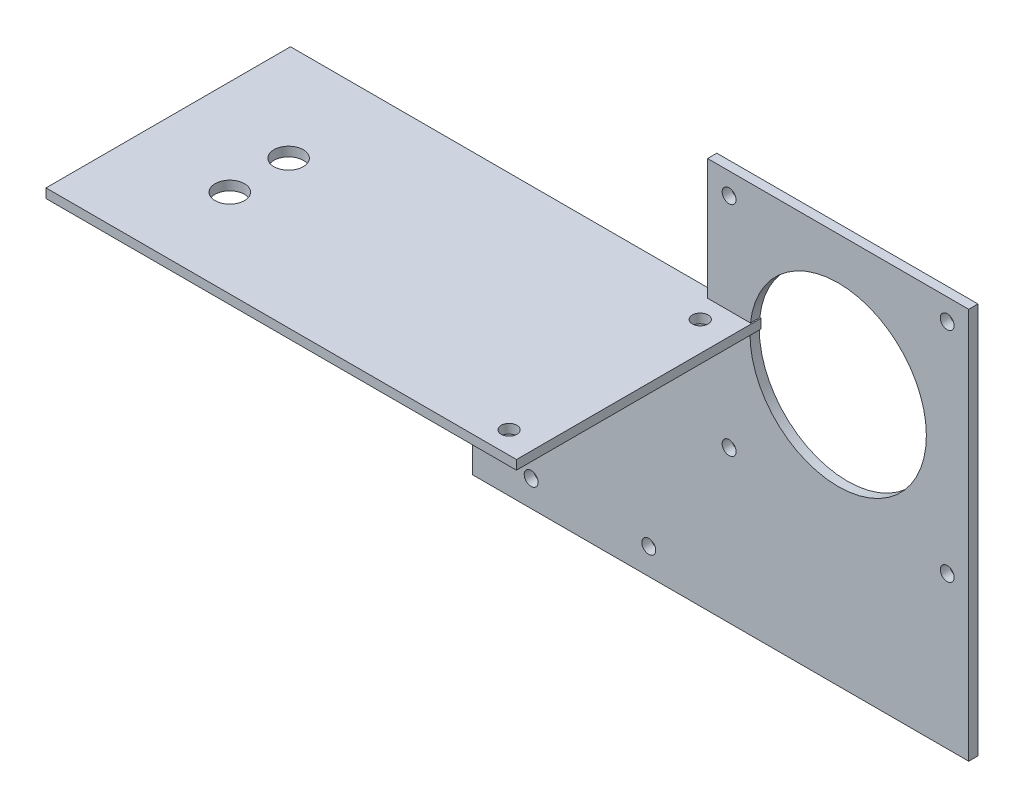
ISO-10303-21;
HEADER;
FILE_DESCRIPTION(('STEP AP214'),'2;1');
FILE_NAME('part.step','',(''),(''),'','','');
FILE_SCHEMA(('AUTOMOTIVE_DESIGN { 1 0 10303 214 1 1 1 1 }'));
ENDSEC;
DATA;
#1=APPLICATION_CONTEXT('core data for automotive mechanical design processes');
#2=APPLICATION_PROTOCOL_DEFINITION('international standard','automotive_design',2000,#1);
#3=PRODUCT_CONTEXT('',#1,'mechanical');
#4=PRODUCT('Part','Part','',(#3));
#5=PRODUCT_RELATED_PRODUCT_CATEGORY('part','',(#4));
#6=PRODUCT_DEFINITION_FORMATION('','',#4);
#7=PRODUCT_DEFINITION_CONTEXT('part definition',#1,'design');
#8=PRODUCT_DEFINITION('design','',#6,#7);
#9=PRODUCT_DEFINITION_SHAPE('','',#8);
#10=(LENGTH_UNIT() NAMED_UNIT(*) SI_UNIT(.MILLI.,.METRE.));
#11=(NAMED_UNIT(*) PLANE_ANGLE_UNIT() SI_UNIT($,.RADIAN.));
#12=(NAMED_UNIT(*) SI_UNIT($,.STERADIAN.) SOLID_ANGLE_UNIT());
#13=UNCERTAINTY_MEASURE_WITH_UNIT(LENGTH_MEASURE(1.E-05),#10,'distance_accuracy_value','');
#14=(GEOMETRIC_REPRESENTATION_CONTEXT(3) GLOBAL_UNCERTAINTY_ASSIGNED_CONTEXT((#13)) GLOBAL_UNIT_ASSIGNED_CONTEXT((#10,
#11,#12)) REPRESENTATION_CONTEXT('',''));
#15=CARTESIAN_POINT('',(0.,0.,0.));
#16=DIRECTION('',(0.,0.,1.));
#17=DIRECTION('',(1.,0.,0.));
#18=AXIS2_PLACEMENT_3D('',#15,#16,#17);
#19=CARTESIAN_POINT('',(0.,58.4,-2.));
#20=DIRECTION('',(0.,1.,0.));
#21=DIRECTION('',(-1.,0.,0.));
#22=AXIS2_PLACEMENT_3D('',#19,#20,#21);
#23=PLANE('',#22);
#24=CARTESIAN_POINT('',(-20.6375,58.4,31.75));
#25=DIRECTION('',(0.,1.,0.));
#26=DIRECTION('',(-1.,0.,0.));
#27=AXIS2_PLACEMENT_3D('',#24,#25,#26);
#28=CIRCLE('',#27,3.175);
#29=CARTESIAN_POINT('',(-23.8125,58.4,31.75));
#30=VERTEX_POINT('',#29);
#31=EDGE_CURVE('E166',#30,#30,#28,.T.);
#32=ORIENTED_EDGE('',*,*,#31,.F.);
#33=EDGE_LOOP('',(#32));
#34=FACE_BOUND('',#33,.T.);
#35=CARTESIAN_POINT('',(-20.6375,58.4,19.05));
#36=DIRECTION('',(0.,1.,0.));
#37=DIRECTION('',(-1.,0.,0.));
#38=AXIS2_PLACEMENT_3D('',#35,#36,#37);
#39=CIRCLE('',#38,3.175);
#40=CARTESIAN_POINT('',(-23.8125,58.4,19.05));
#41=VERTEX_POINT('',#40);
#42=EDGE_CURVE('E156',#41,#41,#39,.T.);
#43=ORIENTED_EDGE('',*,*,#42,.F.);
#44=EDGE_LOOP('',(#43));
#45=FACE_BOUND('',#44,.T.);
#46=CARTESIAN_POINT('',(53.975,58.4,46.0375));
#47=DIRECTION('',(0.,1.,0.));
#48=DIRECTION('',(-1.,0.,0.));
#49=AXIS2_PLACEMENT_3D('',#46,#47,#48);
#50=CIRCLE('',#49,1.7);
#51=CARTESIAN_POINT('',(52.275,58.4,46.0375));
#52=VERTEX_POINT('',#51);
#53=EDGE_CURVE('E153',#52,#52,#50,.T.);
#54=ORIENTED_EDGE('',*,*,#53,.F.);
#55=EDGE_LOOP('',(#54));
#56=FACE_BOUND('',#55,.T.);
#57=CARTESIAN_POINT('',(53.975,58.4,4.7625));
#58=DIRECTION('',(0.,1.,0.));
#59=DIRECTION('',(-1.,0.,0.));
#60=AXIS2_PLACEMENT_3D('',#57,#58,#59);
#61=CIRCLE('',#60,1.7);
#62=CARTESIAN_POINT('',(52.275,58.4,4.7625));
#63=VERTEX_POINT('',#62);
#64=EDGE_CURVE('E150',#63,#63,#61,.T.);
#65=ORIENTED_EDGE('',*,*,#64,.F.);
#66=EDGE_LOOP('',(#65));
#67=FACE_BOUND('',#66,.T.);
#68=DIRECTION('',(-1.,0.,0.));
#69=VECTOR('',#68,1.);
#70=CARTESIAN_POINT('',(0.,58.4,-2.));
#71=LINE('',#70,#69);
#72=CARTESIAN_POINT('',(50.8,58.4,-2.));
#73=VERTEX_POINT('',#72);
#74=CARTESIAN_POINT('',(-41.275,58.4,-2.));
#75=VERTEX_POINT('',#74);
#76=EDGE_CURVE('E139',#73,#75,#71,.T.);
#77=ORIENTED_EDGE('',*,*,#76,.T.);
#78=DIRECTION('',(0.,0.,-1.));
#79=VECTOR('',#78,1.);
#80=CARTESIAN_POINT('',(-41.275,58.4,50.8));
#81=LINE('',#80,#79);
#82=CARTESIAN_POINT('',(-41.275,58.4,50.8));
#83=VERTEX_POINT('',#82);
#84=EDGE_CURVE('E193',#83,#75,#81,.T.);
#85=ORIENTED_EDGE('',*,*,#84,.F.);
#86=DIRECTION('',(1.,0.,0.));
#87=VECTOR('',#86,1.);
#88=CARTESIAN_POINT('',(60.325,58.4,50.8));
#89=LINE('',#88,#87);
#90=CARTESIAN_POINT('',(60.325,58.4,50.8));
#91=VERTEX_POINT('',#90);
#92=EDGE_CURVE('E171',#83,#91,#89,.T.);
#93=ORIENTED_EDGE('',*,*,#92,.T.);
#94=DIRECTION('',(0.,0.,-1.));
#95=VECTOR('',#94,1.);
#96=CARTESIAN_POINT('',(60.325,58.4,50.8));
#97=LINE('',#96,#95);
#98=CARTESIAN_POINT('',(60.325,58.4,-2.));
#99=VERTEX_POINT('',#98);
#100=EDGE_CURVE('E184',#91,#99,#97,.T.);
#101=ORIENTED_EDGE('',*,*,#100,.T.);
#102=DIRECTION('',(1.,0.,0.));
#103=VECTOR('',#102,1.);
#104=CARTESIAN_POINT('',(0.,58.4,-2.));
#105=LINE('',#104,#103);
#106=CARTESIAN_POINT('',(60.0625754399979,58.4,-2.));
#107=VERTEX_POINT('',#106);
#108=EDGE_CURVE('E175',#107,#99,#105,.T.);
#109=ORIENTED_EDGE('',*,*,#108,.F.);
#110=DIRECTION('',(0.,0.,1.));
#111=VECTOR('',#110,1.);
#112=CARTESIAN_POINT('',(60.0625754399979,58.4,-2.));
#113=LINE('',#112,#111);
#114=CARTESIAN_POINT('',(60.0625754399979,58.4,0.));
#115=VERTEX_POINT('',#114);
#116=EDGE_CURVE('E11',#115,#107,#113,.F.);
#117=ORIENTED_EDGE('',*,*,#116,.F.);
#118=DIRECTION('',(-1.,0.,0.));
#119=VECTOR('',#118,1.);
#120=CARTESIAN_POINT('',(0.,58.4,0.));
#121=LINE('',#120,#119);
#122=CARTESIAN_POINT('',(50.8,58.4,0.));
#123=VERTEX_POINT('',#122);
#124=EDGE_CURVE('E210',#115,#123,#121,.T.);
#125=ORIENTED_EDGE('',*,*,#124,.T.);
#126=DIRECTION('',(0.,0.,1.));
#127=VECTOR('',#126,1.);
#128=CARTESIAN_POINT('',(50.8,58.4,-2.));
#129=LINE('',#128,#127);
#130=EDGE_CURVE('E59',#73,#123,#129,.T.);
#131=ORIENTED_EDGE('',*,*,#130,.F.);
#132=EDGE_LOOP('',(#77,#85,#93,#101,#109,#117,#125,#131));
#133=FACE_BOUND('',#132,.T.);
#134=ADVANCED_FACE('F34',(#34,#45,#56,#67,#133),#23,.T.);
#135=CARTESIAN_POINT('',(50.8,58.4,-2.));
#136=DIRECTION('',(-1.,0.,0.));
#137=DIRECTION('',(0.,0.,1.));
#138=AXIS2_PLACEMENT_3D('',#135,#136,#137);
#139=PLANE('',#138);
#140=DIRECTION('',(0.,-1.,0.));
#141=VECTOR('',#140,1.);
#142=CARTESIAN_POINT('',(50.8,58.4,0.));
#143=LINE('',#142,#141);
#144=CARTESIAN_POINT('',(50.8,84.53204182,0.));
#145=VERTEX_POINT('',#144);
#146=EDGE_CURVE('E136',#145,#123,#143,.T.);
#147=ORIENTED_EDGE('',*,*,#146,.F.);
#148=DIRECTION('',(0.,0.,1.));
#149=VECTOR('',#148,1.);
#150=CARTESIAN_POINT('',(50.8,84.53204182,-2.));
#151=LINE('',#150,#149);
#152=CARTESIAN_POINT('',(50.8,84.53204182,-2.));
#153=VERTEX_POINT('',#152);
#154=EDGE_CURVE('E81',#153,#145,#151,.T.);
#155=ORIENTED_EDGE('',*,*,#154,.F.);
#156=DIRECTION('',(0.,-1.,0.));
#157=VECTOR('',#156,1.);
#158=CARTESIAN_POINT('',(50.8,58.4,-2.));
#159=LINE('',#158,#157);
#160=EDGE_CURVE('E117',#153,#73,#159,.T.);
#161=ORIENTED_EDGE('',*,*,#160,.T.);
#162=ORIENTED_EDGE('',*,*,#130,.T.);
#163=EDGE_LOOP('',(#147,#155,#161,#162));
#164=FACE_BOUND('',#163,.T.);
#165=ADVANCED_FACE('F315',(#164),#139,.T.);
#166=CARTESIAN_POINT('',(50.8,84.53204182,-2.));
#167=DIRECTION('',(0.,1.,0.));
#168=DIRECTION('',(0.,0.,1.));
#169=AXIS2_PLACEMENT_3D('',#166,#167,#168);
#170=PLANE('',#169);
#171=DIRECTION('',(-1.,0.,0.));
#172=VECTOR('',#171,1.);
#173=CARTESIAN_POINT('',(50.8,84.53204182,0.));
#174=LINE('',#173,#172);
#175=CARTESIAN_POINT('',(107.2,84.53204182,0.));
#176=VERTEX_POINT('',#175);
#177=EDGE_CURVE('E102',#176,#145,#174,.T.);
#178=ORIENTED_EDGE('',*,*,#177,.F.);
#179=DIRECTION('',(0.,0.,1.));
#180=VECTOR('',#179,1.);
#181=CARTESIAN_POINT('',(107.2,84.53204182,-2.));
#182=LINE('',#181,#180);
#183=CARTESIAN_POINT('',(107.2,84.53204182,-2.));
#184=VERTEX_POINT('',#183);
#185=EDGE_CURVE('E97',#184,#176,#182,.T.);
#186=ORIENTED_EDGE('',*,*,#185,.F.);
#187=DIRECTION('',(-1.,0.,0.));
#188=VECTOR('',#187,1.);
#189=CARTESIAN_POINT('',(50.8,84.53204182,-2.));
#190=LINE('',#189,#188);
#191=EDGE_CURVE('E100',#184,#153,#190,.T.);
#192=ORIENTED_EDGE('',*,*,#191,.T.);
#193=ORIENTED_EDGE('',*,*,#154,.T.);
#194=EDGE_LOOP('',(#178,#186,#192,#193));
#195=FACE_BOUND('',#194,.T.);
#196=ADVANCED_FACE('F99',(#195),#170,.T.);
#197=CARTESIAN_POINT('',(107.2,84.53204182,-2.));
#198=DIRECTION('',(1.,0.,0.));
#199=DIRECTION('',(0.,0.,-1.));
#200=AXIS2_PLACEMENT_3D('',#197,#198,#199);
#201=PLANE('',#200);
#202=DIRECTION('',(0.,1.,0.));
#203=VECTOR('',#202,1.);
#204=CARTESIAN_POINT('',(107.2,84.53204182,0.));
#205=LINE('',#204,#203);
#206=CARTESIAN_POINT('',(107.2,0.,0.));
#207=VERTEX_POINT('',#206);
#208=EDGE_CURVE('E133',#207,#176,#205,.T.);
#209=ORIENTED_EDGE('',*,*,#208,.F.);
#210=DIRECTION('',(0.,0.,1.));
#211=VECTOR('',#210,1.);
#212=CARTESIAN_POINT('',(107.2,0.,-2.));
#213=LINE('',#212,#211);
#214=CARTESIAN_POINT('',(107.2,0.,-2.));
#215=VERTEX_POINT('',#214);
#216=EDGE_CURVE('E107',#215,#207,#213,.T.);
#217=ORIENTED_EDGE('',*,*,#216,.F.);
#218=DIRECTION('',(0.,1.,0.));
#219=VECTOR('',#218,1.);
#220=CARTESIAN_POINT('',(107.2,84.53204182,-2.));
#221=LINE('',#220,#219);
#222=EDGE_CURVE('E114',#215,#184,#221,.T.);
#223=ORIENTED_EDGE('',*,*,#222,.T.);
#224=ORIENTED_EDGE('',*,*,#185,.T.);
#225=EDGE_LOOP('',(#209,#217,#223,#224));
#226=FACE_BOUND('',#225,.T.);
#227=ADVANCED_FACE('F119',(#226),#201,.T.);
#228=CARTESIAN_POINT('',(0.,0.,-2.));
#229=DIRECTION('',(0.,-1.,0.));
#230=DIRECTION('',(0.,0.,-1.));
#231=AXIS2_PLACEMENT_3D('',#228,#229,#230);
#232=PLANE('',#231);
#233=DIRECTION('',(1.,0.,0.));
#234=VECTOR('',#233,1.);
#235=CARTESIAN_POINT('',(0.,0.,0.));
#236=LINE('',#235,#234);
#237=CARTESIAN_POINT('',(0.,0.,0.));
#238=VERTEX_POINT('',#237);
#239=EDGE_CURVE('E129',#238,#207,#236,.T.);
#240=ORIENTED_EDGE('',*,*,#239,.F.);
#241=DIRECTION('',(0.,0.,1.));
#242=VECTOR('',#241,1.);
#243=CARTESIAN_POINT('',(0.,0.,-2.));
#244=LINE('',#243,#242);
#245=CARTESIAN_POINT('',(0.,0.,-2.));
#246=VERTEX_POINT('',#245);
#247=EDGE_CURVE('E126',#246,#238,#244,.T.);
#248=ORIENTED_EDGE('',*,*,#247,.F.);
#249=DIRECTION('',(1.,0.,0.));
#250=VECTOR('',#249,1.);
#251=CARTESIAN_POINT('',(0.,0.,-2.));
#252=LINE('',#251,#250);
#253=EDGE_CURVE('E120',#246,#215,#252,.T.);
#254=ORIENTED_EDGE('',*,*,#253,.T.);
#255=ORIENTED_EDGE('',*,*,#216,.T.);
#256=EDGE_LOOP('',(#240,#248,#254,#255));
#257=FACE_BOUND('',#256,.T.);
#258=ADVANCED_FACE('F322',(#257),#232,.T.);
#259=CARTESIAN_POINT('',(0.,58.4,-2.));
#260=DIRECTION('',(-1.,0.,0.));
#261=DIRECTION('',(0.,0.,1.));
#262=AXIS2_PLACEMENT_3D('',#259,#260,#261);
#263=PLANE('',#262);
#264=DIRECTION('',(0.,0.,1.));
#265=VECTOR('',#264,1.);
#266=CARTESIAN_POINT('',(0.,56.4,-2.));
#267=LINE('',#266,#265);
#268=CARTESIAN_POINT('',(0.,56.4,-2.));
#269=VERTEX_POINT('',#268);
#270=CARTESIAN_POINT('',(0.,56.4,0.));
#271=VERTEX_POINT('',#270);
#272=EDGE_CURVE('E207',#269,#271,#267,.T.);
#273=ORIENTED_EDGE('',*,*,#272,.F.);
#274=DIRECTION('',(0.,-1.,0.));
#275=VECTOR('',#274,1.);
#276=CARTESIAN_POINT('',(0.,58.4,-2.));
#277=LINE('',#276,#275);
#278=EDGE_CURVE('E90',#269,#246,#277,.T.);
#279=ORIENTED_EDGE('',*,*,#278,.T.);
#280=ORIENTED_EDGE('',*,*,#247,.T.);
#281=DIRECTION('',(0.,-1.,0.));
#282=VECTOR('',#281,1.);
#283=CARTESIAN_POINT('',(0.,58.4,0.));
#284=LINE('',#283,#282);
#285=EDGE_CURVE('E127',#271,#238,#284,.T.);
#286=ORIENTED_EDGE('',*,*,#285,.F.);
#287=EDGE_LOOP('',(#273,#279,#280,#286));
#288=FACE_BOUND('',#287,.T.);
#289=ADVANCED_FACE('F323',(#288),#263,.T.);
#290=CARTESIAN_POINT('',(0.,0.,-2.));
#291=DIRECTION('',(0.,0.,1.));
#292=DIRECTION('',(1.,0.,0.));
#293=AXIS2_PLACEMENT_3D('',#290,#291,#292);
#294=PLANE('',#293);
#295=ORIENTED_EDGE('',*,*,#76,.F.);
#296=ORIENTED_EDGE('',*,*,#160,.F.);
#297=ORIENTED_EDGE('',*,*,#191,.F.);
#298=ORIENTED_EDGE('',*,*,#222,.F.);
#299=ORIENTED_EDGE('',*,*,#253,.F.);
#300=ORIENTED_EDGE('',*,*,#278,.F.);
#301=DIRECTION('',(-1.,0.,0.));
#302=VECTOR('',#301,1.);
#303=CARTESIAN_POINT('',(-41.275,56.4,-2.));
#304=LINE('',#303,#302);
#305=CARTESIAN_POINT('',(-41.275,56.4,-2.));
#306=VERTEX_POINT('',#305);
#307=EDGE_CURVE('E186',#269,#306,#304,.T.);
#308=ORIENTED_EDGE('',*,*,#307,.T.);
#309=DIRECTION('',(0.,1.,0.));
#310=VECTOR('',#309,1.);
#311=CARTESIAN_POINT('',(-41.275,58.4,-2.));
#312=LINE('',#311,#310);
#313=EDGE_CURVE('E188',#306,#75,#312,.T.);
#314=ORIENTED_EDGE('',*,*,#313,.T.);
#315=EDGE_LOOP('',(#295,#296,#297,#298,#299,#300,#308,#314));
#316=FACE_BOUND('',#315,.T.);
#317=CARTESIAN_POINT('',(38.1,5.65,-2.));
#318=DIRECTION('',(0.,0.,1.));
#319=DIRECTION('',(1.,0.,0.));
#320=AXIS2_PLACEMENT_3D('',#317,#318,#319);
#321=CIRCLE('',#320,1.5);
#322=CARTESIAN_POINT('',(39.6,5.65,-2.));
#323=VERTEX_POINT('',#322);
#324=EDGE_CURVE('E218',#323,#323,#321,.T.);
#325=ORIENTED_EDGE('',*,*,#324,.T.);
#326=EDGE_LOOP('',(#325));
#327=FACE_BOUND('',#326,.T.);
#328=CARTESIAN_POINT('',(12.7,5.65000000000001,-2.));
#329=DIRECTION('',(0.,0.,1.));
#330=DIRECTION('',(1.,0.,0.));
#331=AXIS2_PLACEMENT_3D('',#328,#329,#330);
#332=CIRCLE('',#331,1.5);
#333=CARTESIAN_POINT('',(14.2,5.65000000000001,-2.));
#334=VERTEX_POINT('',#333);
#335=EDGE_CURVE('E224',#334,#334,#332,.T.);
#336=ORIENTED_EDGE('',*,*,#335,.T.);
#337=EDGE_LOOP('',(#336));
#338=FACE_BOUND('',#337,.T.);
#339=CARTESIAN_POINT('',(38.1,52.75,-2.));
#340=DIRECTION('',(0.,0.,1.));
#341=DIRECTION('',(1.,0.,0.));
#342=AXIS2_PLACEMENT_3D('',#339,#340,#341);
#343=CIRCLE('',#342,1.5);
#344=CARTESIAN_POINT('',(39.6,52.75,-2.));
#345=VERTEX_POINT('',#344);
#346=EDGE_CURVE('E230',#345,#345,#343,.T.);
#347=ORIENTED_EDGE('',*,*,#346,.T.);
#348=EDGE_LOOP('',(#347));
#349=FACE_BOUND('',#348,.T.);
#350=CARTESIAN_POINT('',(12.7,52.75,-2.));
#351=DIRECTION('',(0.,0.,1.));
#352=DIRECTION('',(1.,0.,0.));
#353=AXIS2_PLACEMENT_3D('',#350,#351,#352);
#354=CIRCLE('',#353,1.5);
#355=CARTESIAN_POINT('',(14.2,52.75,-2.));
#356=VERTEX_POINT('',#355);
#357=EDGE_CURVE('E236',#356,#356,#354,.T.);
#358=ORIENTED_EDGE('',*,*,#357,.T.);
#359=EDGE_LOOP('',(#358));
#360=FACE_BOUND('',#359,.T.);
#361=CARTESIAN_POINT('',(55.45,79.88204182,-2.));
#362=DIRECTION('',(0.,0.,1.));
#363=DIRECTION('',(1.,0.,0.));
#364=AXIS2_PLACEMENT_3D('',#361,#362,#363);
#365=CIRCLE('',#364,1.5);
#366=CARTESIAN_POINT('',(56.95,79.88204182,-2.));
#367=VERTEX_POINT('',#366);
#368=EDGE_CURVE('E242',#367,#367,#365,.T.);
#369=ORIENTED_EDGE('',*,*,#368,.T.);
#370=EDGE_LOOP('',(#369));
#371=FACE_BOUND('',#370,.T.);
#372=CARTESIAN_POINT('',(55.45,32.78204182,-2.));
#373=DIRECTION('',(0.,0.,1.));
#374=DIRECTION('',(1.,0.,0.));
#375=AXIS2_PLACEMENT_3D('',#372,#373,#374);
#376=CIRCLE('',#375,1.5);
#377=CARTESIAN_POINT('',(56.95,32.78204182,-2.));
#378=VERTEX_POINT('',#377);
#379=EDGE_CURVE('E248',#378,#378,#376,.T.);
#380=ORIENTED_EDGE('',*,*,#379,.T.);
#381=EDGE_LOOP('',(#380));
#382=FACE_BOUND('',#381,.T.);
#383=CARTESIAN_POINT('',(102.55,32.78204182,-2.));
#384=DIRECTION('',(0.,0.,1.));
#385=DIRECTION('',(1.,0.,0.));
#386=AXIS2_PLACEMENT_3D('',#383,#384,#385);
#387=CIRCLE('',#386,1.5);
#388=CARTESIAN_POINT('',(104.05,32.78204182,-2.));
#389=VERTEX_POINT('',#388);
#390=EDGE_CURVE('E254',#389,#389,#387,.T.);
#391=ORIENTED_EDGE('',*,*,#390,.T.);
#392=EDGE_LOOP('',(#391));
#393=FACE_BOUND('',#392,.T.);
#394=CARTESIAN_POINT('',(102.55,79.88204182,-2.));
#395=DIRECTION('',(0.,0.,1.));
#396=DIRECTION('',(1.,0.,0.));
#397=AXIS2_PLACEMENT_3D('',#394,#395,#396);
#398=CIRCLE('',#397,1.5);
#399=CARTESIAN_POINT('',(104.05,79.88204182,-2.));
#400=VERTEX_POINT('',#399);
#401=EDGE_CURVE('E130',#400,#400,#398,.T.);
#402=ORIENTED_EDGE('',*,*,#401,.T.);
#403=EDGE_LOOP('',(#402));
#404=FACE_BOUND('',#403,.T.);
#405=CARTESIAN_POINT('',(79.,56.33204182,-2.));
#406=DIRECTION('',(0.,0.,1.));
#407=DIRECTION('',(1.,0.,0.));
#408=AXIS2_PLACEMENT_3D('',#405,#406,#407);
#409=CIRCLE('',#408,19.05);
#410=CARTESIAN_POINT('',(59.9501212159822,56.4,-2.));
#411=VERTEX_POINT('',#410);
#412=EDGE_CURVE('E213',#411,#107,#409,.T.);
#413=ORIENTED_EDGE('',*,*,#412,.T.);
#414=ORIENTED_EDGE('',*,*,#108,.T.);
#415=DIRECTION('',(0.,-1.,0.));
#416=VECTOR('',#415,1.);
#417=CARTESIAN_POINT('',(60.325,56.4,-2.));
#418=LINE('',#417,#416);
#419=CARTESIAN_POINT('',(60.325,56.4,-2.));
#420=VERTEX_POINT('',#419);
#421=EDGE_CURVE('E149',#99,#420,#418,.T.);
#422=ORIENTED_EDGE('',*,*,#421,.T.);
#423=EDGE_CURVE('E50',#420,#411,#304,.T.);
#424=ORIENTED_EDGE('',*,*,#423,.T.);
#425=EDGE_LOOP('',(#413,#414,#422,#424));
#426=FACE_BOUND('',#425,.T.);
#427=ADVANCED_FACE('F111',(#316,#327,#338,#349,#360,#371,#382,#393,#404,#426),#294,.F.);
#428=CARTESIAN_POINT('',(0.,0.,0.));
#429=DIRECTION('',(0.,0.,1.));
#430=DIRECTION('',(1.,0.,0.));
#431=AXIS2_PLACEMENT_3D('',#428,#429,#430);
#432=PLANE('',#431);
#433=ORIENTED_EDGE('',*,*,#124,.F.);
#434=CARTESIAN_POINT('',(79.,56.33204182,0.));
#435=DIRECTION('',(0.,0.,1.));
#436=DIRECTION('',(1.,0.,0.));
#437=AXIS2_PLACEMENT_3D('',#434,#435,#436);
#438=CIRCLE('',#437,19.05);
#439=CARTESIAN_POINT('',(59.9501212159822,56.4,0.));
#440=VERTEX_POINT('',#439);
#441=EDGE_CURVE('E212',#440,#115,#438,.T.);
#442=ORIENTED_EDGE('',*,*,#441,.F.);
#443=DIRECTION('',(1.,0.,0.));
#444=VECTOR('',#443,1.);
#445=CARTESIAN_POINT('',(0.,56.4,0.));
#446=LINE('',#445,#444);
#447=EDGE_CURVE('E196',#271,#440,#446,.T.);
#448=ORIENTED_EDGE('',*,*,#447,.F.);
#449=ORIENTED_EDGE('',*,*,#285,.T.);
#450=ORIENTED_EDGE('',*,*,#239,.T.);
#451=ORIENTED_EDGE('',*,*,#208,.T.);
#452=ORIENTED_EDGE('',*,*,#177,.T.);
#453=ORIENTED_EDGE('',*,*,#146,.T.);
#454=EDGE_LOOP('',(#433,#442,#448,#449,#450,#451,#452,#453));
#455=FACE_BOUND('',#454,.T.);
#456=CARTESIAN_POINT('',(38.1,5.65,0.));
#457=DIRECTION('',(0.,0.,1.));
#458=DIRECTION('',(1.,0.,0.));
#459=AXIS2_PLACEMENT_3D('',#456,#457,#458);
#460=CIRCLE('',#459,1.5);
#461=CARTESIAN_POINT('',(39.6,5.65,0.));
#462=VERTEX_POINT('',#461);
#463=EDGE_CURVE('E215',#462,#462,#460,.T.);
#464=ORIENTED_EDGE('',*,*,#463,.F.);
#465=EDGE_LOOP('',(#464));
#466=FACE_BOUND('',#465,.T.);
#467=CARTESIAN_POINT('',(12.7,5.65000000000001,0.));
#468=DIRECTION('',(0.,0.,1.));
#469=DIRECTION('',(1.,0.,0.));
#470=AXIS2_PLACEMENT_3D('',#467,#468,#469);
#471=CIRCLE('',#470,1.5);
#472=CARTESIAN_POINT('',(14.2,5.65000000000001,0.));
#473=VERTEX_POINT('',#472);
#474=EDGE_CURVE('E221',#473,#473,#471,.T.);
#475=ORIENTED_EDGE('',*,*,#474,.F.);
#476=EDGE_LOOP('',(#475));
#477=FACE_BOUND('',#476,.T.);
#478=CARTESIAN_POINT('',(38.1,52.75,0.));
#479=DIRECTION('',(0.,0.,1.));
#480=DIRECTION('',(1.,0.,0.));
#481=AXIS2_PLACEMENT_3D('',#478,#479,#480);
#482=CIRCLE('',#481,1.5);
#483=CARTESIAN_POINT('',(39.6,52.75,0.));
#484=VERTEX_POINT('',#483);
#485=EDGE_CURVE('E227',#484,#484,#482,.T.);
#486=ORIENTED_EDGE('',*,*,#485,.F.);
#487=EDGE_LOOP('',(#486));
#488=FACE_BOUND('',#487,.T.);
#489=CARTESIAN_POINT('',(12.7,52.75,0.));
#490=DIRECTION('',(0.,0.,1.));
#491=DIRECTION('',(1.,0.,0.));
#492=AXIS2_PLACEMENT_3D('',#489,#490,#491);
#493=CIRCLE('',#492,1.5);
#494=CARTESIAN_POINT('',(14.2,52.75,0.));
#495=VERTEX_POINT('',#494);
#496=EDGE_CURVE('E233',#495,#495,#493,.T.);
#497=ORIENTED_EDGE('',*,*,#496,.F.);
#498=EDGE_LOOP('',(#497));
#499=FACE_BOUND('',#498,.T.);
#500=CARTESIAN_POINT('',(55.45,79.88204182,0.));
#501=DIRECTION('',(0.,0.,1.));
#502=DIRECTION('',(1.,0.,0.));
#503=AXIS2_PLACEMENT_3D('',#500,#501,#502);
#504=CIRCLE('',#503,1.5);
#505=CARTESIAN_POINT('',(56.95,79.88204182,0.));
#506=VERTEX_POINT('',#505);
#507=EDGE_CURVE('E239',#506,#506,#504,.T.);
#508=ORIENTED_EDGE('',*,*,#507,.F.);
#509=EDGE_LOOP('',(#508));
#510=FACE_BOUND('',#509,.T.);
#511=CARTESIAN_POINT('',(55.45,32.78204182,0.));
#512=DIRECTION('',(0.,0.,1.));
#513=DIRECTION('',(1.,0.,0.));
#514=AXIS2_PLACEMENT_3D('',#511,#512,#513);
#515=CIRCLE('',#514,1.5);
#516=CARTESIAN_POINT('',(56.95,32.78204182,0.));
#517=VERTEX_POINT('',#516);
#518=EDGE_CURVE('E245',#517,#517,#515,.T.);
#519=ORIENTED_EDGE('',*,*,#518,.F.);
#520=EDGE_LOOP('',(#519));
#521=FACE_BOUND('',#520,.T.);
#522=CARTESIAN_POINT('',(102.55,32.78204182,0.));
#523=DIRECTION('',(0.,0.,1.));
#524=DIRECTION('',(1.,0.,0.));
#525=AXIS2_PLACEMENT_3D('',#522,#523,#524);
#526=CIRCLE('',#525,1.5);
#527=CARTESIAN_POINT('',(104.05,32.78204182,0.));
#528=VERTEX_POINT('',#527);
#529=EDGE_CURVE('E251',#528,#528,#526,.T.);
#530=ORIENTED_EDGE('',*,*,#529,.F.);
#531=EDGE_LOOP('',(#530));
#532=FACE_BOUND('',#531,.T.);
#533=CARTESIAN_POINT('',(102.55,79.88204182,0.));
#534=DIRECTION('',(0.,0.,1.));
#535=DIRECTION('',(1.,0.,0.));
#536=AXIS2_PLACEMENT_3D('',#533,#534,#535);
#537=CIRCLE('',#536,1.5);
#538=CARTESIAN_POINT('',(104.05,79.88204182,0.));
#539=VERTEX_POINT('',#538);
#540=EDGE_CURVE('E257',#539,#539,#537,.T.);
#541=ORIENTED_EDGE('',*,*,#540,.F.);
#542=EDGE_LOOP('',(#541));
#543=FACE_BOUND('',#542,.T.);
#544=ADVANCED_FACE('F316',(#455,#466,#477,#488,#499,#510,#521,#532,#543),#432,.T.);
#545=CARTESIAN_POINT('',(102.55,79.88204182,-2.));
#546=DIRECTION('',(0.,0.,1.));
#547=DIRECTION('',(1.,0.,0.));
#548=AXIS2_PLACEMENT_3D('',#545,#546,#547);
#549=CYLINDRICAL_SURFACE('',#548,1.5);
#550=ORIENTED_EDGE('',*,*,#401,.F.);
#551=EDGE_LOOP('',(#550));
#552=FACE_BOUND('',#551,.T.);
#553=ORIENTED_EDGE('',*,*,#540,.T.);
#554=EDGE_LOOP('',(#553));
#555=FACE_BOUND('',#554,.T.);
#556=ADVANCED_FACE('F334',(#552,#555),#549,.F.);
#557=CARTESIAN_POINT('',(102.55,32.78204182,-2.));
#558=DIRECTION('',(0.,0.,1.));
#559=DIRECTION('',(1.,0.,0.));
#560=AXIS2_PLACEMENT_3D('',#557,#558,#559);
#561=CYLINDRICAL_SURFACE('',#560,1.5);
#562=ORIENTED_EDGE('',*,*,#390,.F.);
#563=EDGE_LOOP('',(#562));
#564=FACE_BOUND('',#563,.T.);
#565=ORIENTED_EDGE('',*,*,#529,.T.);
#566=EDGE_LOOP('',(#565));
#567=FACE_BOUND('',#566,.T.);
#568=ADVANCED_FACE('F398',(#564,#567),#561,.F.);
#569=CARTESIAN_POINT('',(55.45,32.78204182,-2.));
#570=DIRECTION('',(0.,0.,1.));
#571=DIRECTION('',(1.,0.,0.));
#572=AXIS2_PLACEMENT_3D('',#569,#570,#571);
#573=CYLINDRICAL_SURFACE('',#572,1.5);
#574=ORIENTED_EDGE('',*,*,#379,.F.);
#575=EDGE_LOOP('',(#574));
#576=FACE_BOUND('',#575,.T.);
#577=ORIENTED_EDGE('',*,*,#518,.T.);
#578=EDGE_LOOP('',(#577));
#579=FACE_BOUND('',#578,.T.);
#580=ADVANCED_FACE('F394',(#576,#579),#573,.F.);
#581=CARTESIAN_POINT('',(55.45,79.88204182,-2.));
#582=DIRECTION('',(0.,0.,1.));
#583=DIRECTION('',(1.,0.,0.));
#584=AXIS2_PLACEMENT_3D('',#581,#582,#583);
#585=CYLINDRICAL_SURFACE('',#584,1.5);
#586=ORIENTED_EDGE('',*,*,#368,.F.);
#587=EDGE_LOOP('',(#586));
#588=FACE_BOUND('',#587,.T.);
#589=ORIENTED_EDGE('',*,*,#507,.T.);
#590=EDGE_LOOP('',(#589));
#591=FACE_BOUND('',#590,.T.);
#592=ADVANCED_FACE('F390',(#588,#591),#585,.F.);
#593=CARTESIAN_POINT('',(12.7,52.75,-2.));
#594=DIRECTION('',(0.,0.,1.));
#595=DIRECTION('',(1.,0.,0.));
#596=AXIS2_PLACEMENT_3D('',#593,#594,#595);
#597=CYLINDRICAL_SURFACE('',#596,1.5);
#598=ORIENTED_EDGE('',*,*,#357,.F.);
#599=EDGE_LOOP('',(#598));
#600=FACE_BOUND('',#599,.T.);
#601=ORIENTED_EDGE('',*,*,#496,.T.);
#602=EDGE_LOOP('',(#601));
#603=FACE_BOUND('',#602,.T.);
#604=ADVANCED_FACE('F386',(#600,#603),#597,.F.);
#605=CARTESIAN_POINT('',(38.1,52.75,-2.));
#606=DIRECTION('',(0.,0.,1.));
#607=DIRECTION('',(1.,0.,0.));
#608=AXIS2_PLACEMENT_3D('',#605,#606,#607);
#609=CYLINDRICAL_SURFACE('',#608,1.5);
#610=ORIENTED_EDGE('',*,*,#346,.F.);
#611=EDGE_LOOP('',(#610));
#612=FACE_BOUND('',#611,.T.);
#613=ORIENTED_EDGE('',*,*,#485,.T.);
#614=EDGE_LOOP('',(#613));
#615=FACE_BOUND('',#614,.T.);
#616=ADVANCED_FACE('F382',(#612,#615),#609,.F.);
#617=CARTESIAN_POINT('',(12.7,5.65000000000001,-2.));
#618=DIRECTION('',(0.,0.,1.));
#619=DIRECTION('',(1.,0.,0.));
#620=AXIS2_PLACEMENT_3D('',#617,#618,#619);
#621=CYLINDRICAL_SURFACE('',#620,1.5);
#622=ORIENTED_EDGE('',*,*,#335,.F.);
#623=EDGE_LOOP('',(#622));
#624=FACE_BOUND('',#623,.T.);
#625=ORIENTED_EDGE('',*,*,#474,.T.);
#626=EDGE_LOOP('',(#625));
#627=FACE_BOUND('',#626,.T.);
#628=ADVANCED_FACE('F378',(#624,#627),#621,.F.);
#629=CARTESIAN_POINT('',(38.1,5.65,-2.));
#630=DIRECTION('',(0.,0.,1.));
#631=DIRECTION('',(1.,0.,0.));
#632=AXIS2_PLACEMENT_3D('',#629,#630,#631);
#633=CYLINDRICAL_SURFACE('',#632,1.5);
#634=ORIENTED_EDGE('',*,*,#324,.F.);
#635=EDGE_LOOP('',(#634));
#636=FACE_BOUND('',#635,.T.);
#637=ORIENTED_EDGE('',*,*,#463,.T.);
#638=EDGE_LOOP('',(#637));
#639=FACE_BOUND('',#638,.T.);
#640=ADVANCED_FACE('F375',(#636,#639),#633,.F.);
#641=CARTESIAN_POINT('',(79.,56.33204182,-2.));
#642=DIRECTION('',(0.,0.,1.));
#643=DIRECTION('',(1.,0.,0.));
#644=AXIS2_PLACEMENT_3D('',#641,#642,#643);
#645=CYLINDRICAL_SURFACE('',#644,19.05);
#646=ORIENTED_EDGE('',*,*,#441,.T.);
#647=ORIENTED_EDGE('',*,*,#116,.T.);
#648=ORIENTED_EDGE('',*,*,#412,.F.);
#649=DIRECTION('',(0.,0.,1.));
#650=VECTOR('',#649,1.);
#651=CARTESIAN_POINT('',(59.9501212159822,56.4,-2.));
#652=LINE('',#651,#650);
#653=EDGE_CURVE('E42',#411,#440,#652,.T.);
#654=ORIENTED_EDGE('',*,*,#653,.T.);
#655=EDGE_LOOP('',(#646,#647,#648,#654));
#656=FACE_BOUND('',#655,.T.);
#657=ADVANCED_FACE('F325',(#656),#645,.F.);
#658=CARTESIAN_POINT('',(-41.275,58.4,50.8));
#659=DIRECTION('',(-1.,0.,0.));
#660=DIRECTION('',(0.,-1.,0.));
#661=AXIS2_PLACEMENT_3D('',#658,#659,#660);
#662=PLANE('',#661);
#663=ORIENTED_EDGE('',*,*,#313,.F.);
#664=DIRECTION('',(0.,0.,-1.));
#665=VECTOR('',#664,1.);
#666=CARTESIAN_POINT('',(-41.275,56.4,50.8));
#667=LINE('',#666,#665);
#668=CARTESIAN_POINT('',(-41.275,56.4,50.8));
#669=VERTEX_POINT('',#668);
#670=EDGE_CURVE('E197',#669,#306,#667,.T.);
#671=ORIENTED_EDGE('',*,*,#670,.F.);
#672=DIRECTION('',(0.,1.,0.));
#673=VECTOR('',#672,1.);
#674=CARTESIAN_POINT('',(-41.275,58.4,50.8));
#675=LINE('',#674,#673);
#676=EDGE_CURVE('E181',#669,#83,#675,.T.);
#677=ORIENTED_EDGE('',*,*,#676,.T.);
#678=ORIENTED_EDGE('',*,*,#84,.T.);
#679=EDGE_LOOP('',(#663,#671,#677,#678));
#680=FACE_BOUND('',#679,.T.);
#681=ADVANCED_FACE('F272',(#680),#662,.T.);
#682=CARTESIAN_POINT('',(-41.275,56.4,50.8));
#683=DIRECTION('',(0.,-1.,0.));
#684=DIRECTION('',(0.,0.,-1.));
#685=AXIS2_PLACEMENT_3D('',#682,#683,#684);
#686=PLANE('',#685);
#687=CARTESIAN_POINT('',(-20.6375,56.4,31.75));
#688=DIRECTION('',(0.,-1.,0.));
#689=DIRECTION('',(0.,0.,-1.));
#690=AXIS2_PLACEMENT_3D('',#687,#688,#689);
#691=CIRCLE('',#690,3.175);
#692=CARTESIAN_POINT('',(-20.6375,56.4,28.575));
#693=VERTEX_POINT('',#692);
#694=EDGE_CURVE('E37',#693,#693,#691,.T.);
#695=ORIENTED_EDGE('',*,*,#694,.F.);
#696=EDGE_LOOP('',(#695));
#697=FACE_BOUND('',#696,.T.);
#698=CARTESIAN_POINT('',(-20.6375,56.4,19.05));
#699=DIRECTION('',(0.,-1.,0.));
#700=DIRECTION('',(0.,0.,-1.));
#701=AXIS2_PLACEMENT_3D('',#698,#699,#700);
#702=CIRCLE('',#701,3.175);
#703=CARTESIAN_POINT('',(-20.6375,56.4,15.875));
#704=VERTEX_POINT('',#703);
#705=EDGE_CURVE('E154',#704,#704,#702,.T.);
#706=ORIENTED_EDGE('',*,*,#705,.F.);
#707=EDGE_LOOP('',(#706));
#708=FACE_BOUND('',#707,.T.);
#709=CARTESIAN_POINT('',(53.975,56.4,46.0375));
#710=DIRECTION('',(0.,-1.,0.));
#711=DIRECTION('',(0.,0.,-1.));
#712=AXIS2_PLACEMENT_3D('',#709,#710,#711);
#713=CIRCLE('',#712,1.7);
#714=CARTESIAN_POINT('',(52.275,56.4,46.0375));
#715=VERTEX_POINT('',#714);
#716=EDGE_CURVE('E151',#715,#715,#713,.T.);
#717=ORIENTED_EDGE('',*,*,#716,.F.);
#718=EDGE_LOOP('',(#717));
#719=FACE_BOUND('',#718,.T.);
#720=CARTESIAN_POINT('',(53.975,56.4,4.7625));
#721=DIRECTION('',(0.,-1.,0.));
#722=DIRECTION('',(0.,0.,-1.));
#723=AXIS2_PLACEMENT_3D('',#720,#721,#722);
#724=CIRCLE('',#723,1.7);
#725=CARTESIAN_POINT('',(52.275,56.4,4.7625));
#726=VERTEX_POINT('',#725);
#727=EDGE_CURVE('E146',#726,#726,#724,.T.);
#728=ORIENTED_EDGE('',*,*,#727,.F.);
#729=EDGE_LOOP('',(#728));
#730=FACE_BOUND('',#729,.T.);
#731=ORIENTED_EDGE('',*,*,#307,.F.);
#732=ORIENTED_EDGE('',*,*,#272,.T.);
#733=ORIENTED_EDGE('',*,*,#447,.T.);
#734=ORIENTED_EDGE('',*,*,#653,.F.);
#735=ORIENTED_EDGE('',*,*,#423,.F.);
#736=DIRECTION('',(0.,0.,-1.));
#737=VECTOR('',#736,1.);
#738=CARTESIAN_POINT('',(60.325,56.4,50.8));
#739=LINE('',#738,#737);
#740=CARTESIAN_POINT('',(60.325,56.4,50.8));
#741=VERTEX_POINT('',#740);
#742=EDGE_CURVE('E200',#741,#420,#739,.T.);
#743=ORIENTED_EDGE('',*,*,#742,.F.);
#744=DIRECTION('',(-1.,0.,0.));
#745=VECTOR('',#744,1.);
#746=CARTESIAN_POINT('',(0.,56.4,50.8));
#747=LINE('',#746,#745);
#748=EDGE_CURVE('E178',#741,#669,#747,.T.);
#749=ORIENTED_EDGE('',*,*,#748,.T.);
#750=ORIENTED_EDGE('',*,*,#670,.T.);
#751=EDGE_LOOP('',(#731,#732,#733,#734,#735,#743,#749,#750));
#752=FACE_BOUND('',#751,.T.);
#753=ADVANCED_FACE('F281',(#697,#708,#719,#730,#752),#686,.T.);
#754=CARTESIAN_POINT('',(60.325,56.4,50.8));
#755=DIRECTION('',(1.,0.,0.));
#756=DIRECTION('',(0.,0.,-1.));
#757=AXIS2_PLACEMENT_3D('',#754,#755,#756);
#758=PLANE('',#757);
#759=ORIENTED_EDGE('',*,*,#421,.F.);
#760=ORIENTED_EDGE('',*,*,#100,.F.);
#761=DIRECTION('',(0.,-1.,0.));
#762=VECTOR('',#761,1.);
#763=CARTESIAN_POINT('',(60.325,56.4,50.8));
#764=LINE('',#763,#762);
#765=EDGE_CURVE('E174',#91,#741,#764,.T.);
#766=ORIENTED_EDGE('',*,*,#765,.T.);
#767=ORIENTED_EDGE('',*,*,#742,.T.);
#768=EDGE_LOOP('',(#759,#760,#766,#767));
#769=FACE_BOUND('',#768,.T.);
#770=ADVANCED_FACE('F327',(#769),#758,.T.);
#771=CARTESIAN_POINT('',(0.,0.,50.8));
#772=DIRECTION('',(0.,0.,1.));
#773=DIRECTION('',(1.,0.,0.));
#774=AXIS2_PLACEMENT_3D('',#771,#772,#773);
#775=PLANE('',#774);
#776=ORIENTED_EDGE('',*,*,#92,.F.);
#777=ORIENTED_EDGE('',*,*,#676,.F.);
#778=ORIENTED_EDGE('',*,*,#748,.F.);
#779=ORIENTED_EDGE('',*,*,#765,.F.);
#780=EDGE_LOOP('',(#776,#777,#778,#779));
#781=FACE_BOUND('',#780,.T.);
#782=ADVANCED_FACE('F289',(#781),#775,.T.);
#783=CARTESIAN_POINT('',(53.975,0.,4.7625));
#784=DIRECTION('',(0.,1.,0.));
#785=DIRECTION('',(-1.,0.,0.));
#786=AXIS2_PLACEMENT_3D('',#783,#784,#785);
#787=CYLINDRICAL_SURFACE('',#786,1.7);
#788=CARTESIAN_POINT('',(52.275,56.4,4.7625));
#789=CARTESIAN_POINT('',(52.275,56.4208333333333,4.7625));
#790=CARTESIAN_POINT('',(52.275,56.4416666666667,4.7625));
#791=CARTESIAN_POINT('',(52.275,56.4833333333333,4.7625));
#792=CARTESIAN_POINT('',(52.275,56.5041666666667,4.7625));
#793=CARTESIAN_POINT('',(52.275,56.5458333333333,4.7625));
#794=CARTESIAN_POINT('',(52.275,56.5666666666667,4.7625));
#795=CARTESIAN_POINT('',(52.275,56.6083333333333,4.7625));
#796=CARTESIAN_POINT('',(52.275,56.6291666666667,4.7625));
#797=CARTESIAN_POINT('',(52.275,56.6708333333333,4.7625));
#798=CARTESIAN_POINT('',(52.275,56.6916666666667,4.7625));
#799=CARTESIAN_POINT('',(52.275,56.7333333333333,4.7625));
#800=CARTESIAN_POINT('',(52.275,56.7541666666667,4.7625));
#801=CARTESIAN_POINT('',(52.275,56.7958333333333,4.7625));
#802=CARTESIAN_POINT('',(52.275,56.8166666666667,4.7625));
#803=CARTESIAN_POINT('',(52.275,56.8583333333333,4.7625));
#804=CARTESIAN_POINT('',(52.275,56.8791666666667,4.7625));
#805=CARTESIAN_POINT('',(52.275,56.9208333333333,4.7625));
#806=CARTESIAN_POINT('',(52.275,56.9416666666667,4.7625));
#807=CARTESIAN_POINT('',(52.275,56.9833333333333,4.7625));
#808=CARTESIAN_POINT('',(52.275,57.0041666666667,4.7625));
#809=CARTESIAN_POINT('',(52.275,57.0458333333333,4.7625));
#810=CARTESIAN_POINT('',(52.275,57.0666666666667,4.7625));
#811=CARTESIAN_POINT('',(52.275,57.1083333333333,4.7625));
#812=CARTESIAN_POINT('',(52.275,57.1291666666667,4.7625));
#813=CARTESIAN_POINT('',(52.275,57.1708333333333,4.7625));
#814=CARTESIAN_POINT('',(52.275,57.1916666666667,4.7625));
#815=CARTESIAN_POINT('',(52.275,57.2333333333333,4.7625));
#816=CARTESIAN_POINT('',(52.275,57.2541666666667,4.7625));
#817=CARTESIAN_POINT('',(52.275,57.2958333333333,4.7625));
#818=CARTESIAN_POINT('',(52.275,57.3166666666667,4.7625));
#819=CARTESIAN_POINT('',(52.275,57.3583333333333,4.7625));
#820=CARTESIAN_POINT('',(52.275,57.3791666666667,4.7625));
#821=CARTESIAN_POINT('',(52.275,57.4208333333333,4.7625));
#822=CARTESIAN_POINT('',(52.275,57.4416666666667,4.7625));
#823=CARTESIAN_POINT('',(52.275,57.4833333333333,4.7625));
#824=CARTESIAN_POINT('',(52.275,57.5041666666667,4.7625));
#825=CARTESIAN_POINT('',(52.275,57.5458333333333,4.7625));
#826=CARTESIAN_POINT('',(52.275,57.5666666666667,4.7625));
#827=CARTESIAN_POINT('',(52.275,57.6083333333333,4.7625));
#828=CARTESIAN_POINT('',(52.275,57.6291666666667,4.7625));
#829=CARTESIAN_POINT('',(52.275,57.6708333333333,4.7625));
#830=CARTESIAN_POINT('',(52.275,57.6916666666667,4.7625));
#831=CARTESIAN_POINT('',(52.275,57.7333333333333,4.7625));
#832=CARTESIAN_POINT('',(52.275,57.7541666666667,4.7625));
#833=CARTESIAN_POINT('',(52.275,57.7958333333333,4.7625));
#834=CARTESIAN_POINT('',(52.275,57.8166666666667,4.7625));
#835=CARTESIAN_POINT('',(52.275,57.8583333333333,4.7625));
#836=CARTESIAN_POINT('',(52.275,57.8791666666667,4.7625));
#837=CARTESIAN_POINT('',(52.275,57.9208333333333,4.7625));
#838=CARTESIAN_POINT('',(52.275,57.9416666666667,4.7625));
#839=CARTESIAN_POINT('',(52.275,57.9833333333333,4.7625));
#840=CARTESIAN_POINT('',(52.275,58.0041666666667,4.7625));
#841=CARTESIAN_POINT('',(52.275,58.0458333333333,4.7625));
#842=CARTESIAN_POINT('',(52.275,58.0666666666667,4.7625));
#843=CARTESIAN_POINT('',(52.275,58.1083333333333,4.7625));
#844=CARTESIAN_POINT('',(52.275,58.1291666666667,4.7625));
#845=CARTESIAN_POINT('',(52.275,58.1708333333333,4.7625));
#846=CARTESIAN_POINT('',(52.275,58.1916666666667,4.7625));
#847=CARTESIAN_POINT('',(52.275,58.2333333333333,4.7625));
#848=CARTESIAN_POINT('',(52.275,58.2541666666667,4.7625));
#849=CARTESIAN_POINT('',(52.275,58.2958333333333,4.7625));
#850=CARTESIAN_POINT('',(52.275,58.3166666666667,4.7625));
#851=CARTESIAN_POINT('',(52.275,58.3583333333333,4.7625));
#852=CARTESIAN_POINT('',(52.275,58.3791666666667,4.7625));
#853=CARTESIAN_POINT('',(52.275,58.4,4.7625));
#854=B_SPLINE_CURVE_WITH_KNOTS('',3,(#788,#789,#790,#791,#792,#793,#794,#795,#796,#797,#798,
#799,#800,#801,#802,#803,#804,#805,#806,#807,#808,#809,#810,#811,#812,#813,#814,#815,#816,#817,
#818,#819,#820,#821,#822,#823,#824,#825,#826,#827,#828,#829,#830,#831,#832,#833,#834,#835,#836,
#837,#838,#839,#840,#841,#842,#843,#844,#845,#846,#847,#848,#849,#850,#851,#852,#853),
.UNSPECIFIED.,.F.,.F.,(4,2,2,2,2,2,2,2,2,2,2,2,2,2,2,2,2,2,2,2,2,2,2,2,2,2,2,2,2,2,2,2,4),(0.,
0.0625000000000001,0.125,0.1875,0.25,0.3125,0.375,0.4375,0.5,0.5625,0.625000000000001,
0.687500000000001,0.750000000000001,0.812500000000001,0.875000000000001,0.937500000000001,1.,
1.0625,1.125,1.1875,1.25,1.3125,1.375,1.4375,1.5,1.5625,1.625,1.6875,1.75,1.8125,1.875,1.9375,
2.),.UNSPECIFIED.);
#855=EDGE_CURVE('BSEAM351',#726,#63,#854,.T.);
#856=ORIENTED_EDGE('',*,*,#727,.T.);
#857=ORIENTED_EDGE('',*,*,#64,.T.);
#858=ORIENTED_EDGE('',*,*,#855,.T.);
#859=ORIENTED_EDGE('',*,*,#855,.F.);
#860=EDGE_LOOP('',(#856,#858,#857,#859));
#861=FACE_BOUND('',#860,.T.);
#862=ADVANCED_FACE('F351',(#861),#787,.F.);
#863=CARTESIAN_POINT('',(53.975,0.,46.0375));
#864=DIRECTION('',(0.,1.,0.));
#865=DIRECTION('',(-1.,0.,0.));
#866=AXIS2_PLACEMENT_3D('',#863,#864,#865);
#867=CYLINDRICAL_SURFACE('',#866,1.7);
#868=CARTESIAN_POINT('',(52.275,56.4,46.0375));
#869=CARTESIAN_POINT('',(52.275,56.4208333333333,46.0375));
#870=CARTESIAN_POINT('',(52.275,56.4416666666667,46.0375));
#871=CARTESIAN_POINT('',(52.275,56.4833333333333,46.0375));
#872=CARTESIAN_POINT('',(52.275,56.5041666666667,46.0375));
#873=CARTESIAN_POINT('',(52.275,56.5458333333333,46.0375));
#874=CARTESIAN_POINT('',(52.275,56.5666666666667,46.0375));
#875=CARTESIAN_POINT('',(52.275,56.6083333333333,46.0375));
#876=CARTESIAN_POINT('',(52.275,56.6291666666667,46.0375));
#877=CARTESIAN_POINT('',(52.275,56.6708333333333,46.0375));
#878=CARTESIAN_POINT('',(52.275,56.6916666666667,46.0375));
#879=CARTESIAN_POINT('',(52.275,56.7333333333333,46.0375));
#880=CARTESIAN_POINT('',(52.275,56.7541666666667,46.0375));
#881=CARTESIAN_POINT('',(52.275,56.7958333333333,46.0375));
#882=CARTESIAN_POINT('',(52.275,56.8166666666667,46.0375));
#883=CARTESIAN_POINT('',(52.275,56.8583333333333,46.0375));
#884=CARTESIAN_POINT('',(52.275,56.8791666666667,46.0375));
#885=CARTESIAN_POINT('',(52.275,56.9208333333333,46.0375));
#886=CARTESIAN_POINT('',(52.275,56.9416666666667,46.0375));
#887=CARTESIAN_POINT('',(52.275,56.9833333333333,46.0375));
#888=CARTESIAN_POINT('',(52.275,57.0041666666667,46.0375));
#889=CARTESIAN_POINT('',(52.275,57.0458333333333,46.0375));
#890=CARTESIAN_POINT('',(52.275,57.0666666666667,46.0375));
#891=CARTESIAN_POINT('',(52.275,57.1083333333333,46.0375));
#892=CARTESIAN_POINT('',(52.275,57.1291666666667,46.0375));
#893=CARTESIAN_POINT('',(52.275,57.1708333333333,46.0375));
#894=CARTESIAN_POINT('',(52.275,57.1916666666667,46.0375));
#895=CARTESIAN_POINT('',(52.275,57.2333333333333,46.0375));
#896=CARTESIAN_POINT('',(52.275,57.2541666666667,46.0375));
#897=CARTESIAN_POINT('',(52.275,57.2958333333333,46.0375));
#898=CARTESIAN_POINT('',(52.275,57.3166666666667,46.0375));
#899=CARTESIAN_POINT('',(52.275,57.3583333333333,46.0375));
#900=CARTESIAN_POINT('',(52.275,57.3791666666667,46.0375));
#901=CARTESIAN_POINT('',(52.275,57.4208333333333,46.0375));
#902=CARTESIAN_POINT('',(52.275,57.4416666666667,46.0375));
#903=CARTESIAN_POINT('',(52.275,57.4833333333333,46.0375));
#904=CARTESIAN_POINT('',(52.275,57.5041666666667,46.0375));
#905=CARTESIAN_POINT('',(52.275,57.5458333333333,46.0375));
#906=CARTESIAN_POINT('',(52.275,57.5666666666667,46.0375));
#907=CARTESIAN_POINT('',(52.275,57.6083333333333,46.0375));
#908=CARTESIAN_POINT('',(52.275,57.6291666666667,46.0375));
#909=CARTESIAN_POINT('',(52.275,57.6708333333333,46.0375));
#910=CARTESIAN_POINT('',(52.275,57.6916666666667,46.0375));
#911=CARTESIAN_POINT('',(52.275,57.7333333333333,46.0375));
#912=CARTESIAN_POINT('',(52.275,57.7541666666667,46.0375));
#913=CARTESIAN_POINT('',(52.275,57.7958333333333,46.0375));
#914=CARTESIAN_POINT('',(52.275,57.8166666666667,46.0375));
#915=CARTESIAN_POINT('',(52.275,57.8583333333333,46.0375));
#916=CARTESIAN_POINT('',(52.275,57.8791666666667,46.0375));
#917=CARTESIAN_POINT('',(52.275,57.9208333333333,46.0375));
#918=CARTESIAN_POINT('',(52.275,57.9416666666667,46.0375));
#919=CARTESIAN_POINT('',(52.275,57.9833333333333,46.0375));
#920=CARTESIAN_POINT('',(52.275,58.0041666666667,46.0375));
#921=CARTESIAN_POINT('',(52.275,58.0458333333333,46.0375));
#922=CARTESIAN_POINT('',(52.275,58.0666666666667,46.0375));
#923=CARTESIAN_POINT('',(52.275,58.1083333333333,46.0375));
#924=CARTESIAN_POINT('',(52.275,58.1291666666667,46.0375));
#925=CARTESIAN_POINT('',(52.275,58.1708333333333,46.0375));
#926=CARTESIAN_POINT('',(52.275,58.1916666666667,46.0375));
#927=CARTESIAN_POINT('',(52.275,58.2333333333333,46.0375));
#928=CARTESIAN_POINT('',(52.275,58.2541666666667,46.0375));
#929=CARTESIAN_POINT('',(52.275,58.2958333333333,46.0375));
#930=CARTESIAN_POINT('',(52.275,58.3166666666667,46.0375));
#931=CARTESIAN_POINT('',(52.275,58.3583333333333,46.0375));
#932=CARTESIAN_POINT('',(52.275,58.3791666666667,46.0375));
#933=CARTESIAN_POINT('',(52.275,58.4,46.0375));
#934=B_SPLINE_CURVE_WITH_KNOTS('',3,(#868,#869,#870,#871,#872,#873,#874,#875,#876,#877,#878,
#879,#880,#881,#882,#883,#884,#885,#886,#887,#888,#889,#890,#891,#892,#893,#894,#895,#896,#897,
#898,#899,#900,#901,#902,#903,#904,#905,#906,#907,#908,#909,#910,#911,#912,#913,#914,#915,#916,
#917,#918,#919,#920,#921,#922,#923,#924,#925,#926,#927,#928,#929,#930,#931,#932,#933),
.UNSPECIFIED.,.F.,.F.,(4,2,2,2,2,2,2,2,2,2,2,2,2,2,2,2,2,2,2,2,2,2,2,2,2,2,2,2,2,2,2,2,4),(0.,
0.0625000000000001,0.125,0.1875,0.25,0.3125,0.375,0.4375,0.5,0.5625,0.625000000000001,
0.687500000000001,0.750000000000001,0.812500000000001,0.875000000000001,0.937500000000001,1.,
1.0625,1.125,1.1875,1.25,1.3125,1.375,1.4375,1.5,1.5625,1.625,1.6875,1.75,1.8125,1.875,1.9375,
2.),.UNSPECIFIED.);
#935=EDGE_CURVE('BSEAM353',#715,#52,#934,.T.);
#936=ORIENTED_EDGE('',*,*,#716,.T.);
#937=ORIENTED_EDGE('',*,*,#53,.T.);
#938=ORIENTED_EDGE('',*,*,#935,.T.);
#939=ORIENTED_EDGE('',*,*,#935,.F.);
#940=EDGE_LOOP('',(#936,#938,#937,#939));
#941=FACE_BOUND('',#940,.T.);
#942=ADVANCED_FACE('F353',(#941),#867,.F.);
#943=CARTESIAN_POINT('',(-20.6375,48.4,19.05));
#944=DIRECTION('',(0.,1.,0.));
#945=DIRECTION('',(-1.,0.,0.));
#946=AXIS2_PLACEMENT_3D('',#943,#944,#945);
#947=CYLINDRICAL_SURFACE('',#946,3.175);
#948=ORIENTED_EDGE('',*,*,#705,.T.);
#949=EDGE_LOOP('',(#948));
#950=FACE_BOUND('',#949,.T.);
#951=ORIENTED_EDGE('',*,*,#42,.T.);
#952=EDGE_LOOP('',(#951));
#953=FACE_BOUND('',#952,.T.);
#954=ADVANCED_FACE('F360',(#950,#953),#947,.F.);
#955=CARTESIAN_POINT('',(-20.6375,48.4,31.75));
#956=DIRECTION('',(0.,1.,0.));
#957=DIRECTION('',(-1.,0.,0.));
#958=AXIS2_PLACEMENT_3D('',#955,#956,#957);
#959=CYLINDRICAL_SURFACE('',#958,3.175);
#960=ORIENTED_EDGE('',*,*,#694,.T.);
#961=EDGE_LOOP('',(#960));
#962=FACE_BOUND('',#961,.T.);
#963=ORIENTED_EDGE('',*,*,#31,.T.);
#964=EDGE_LOOP('',(#963));
#965=FACE_BOUND('',#964,.T.);
#966=ADVANCED_FACE('F564',(#962,#965),#959,.F.);
#967=CLOSED_SHELL('',(#134,#165,#196,#227,#258,#289,#427,#544,#556,#568,#580,#592,#604,#616,
#628,#640,#657,#681,#753,#770,#782,#862,#942,#954,#966));
#968=MANIFOLD_SOLID_BREP('B2',#967);
#969=ADVANCED_BREP_SHAPE_REPRESENTATION('',(#18,#968),#14);
#970=SHAPE_DEFINITION_REPRESENTATION(#9,#969);
ENDSEC;
END-ISO-10303-21;
